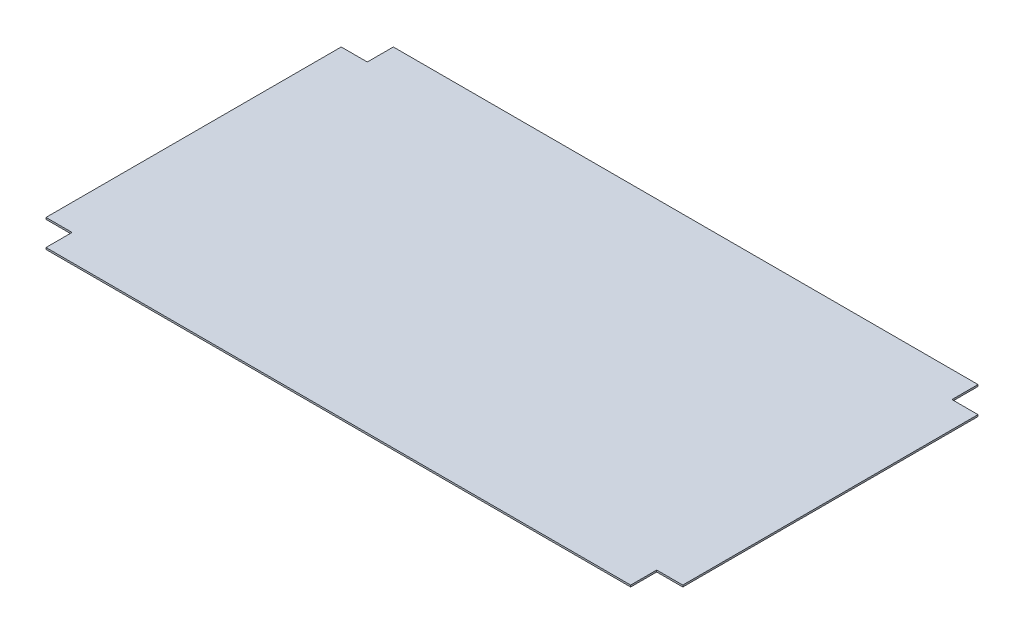
ISO-10303-21;
HEADER;
FILE_DESCRIPTION(('STEP AP214'),'2;1');
FILE_NAME('part.step','',(''),(''),'','','');
FILE_SCHEMA(('AUTOMOTIVE_DESIGN { 1 0 10303 214 1 1 1 1 }'));
ENDSEC;
DATA;
#1=APPLICATION_CONTEXT('core data for automotive mechanical design processes');
#2=APPLICATION_PROTOCOL_DEFINITION('international standard','automotive_design',2000,#1);
#3=PRODUCT_CONTEXT('',#1,'mechanical');
#4=PRODUCT('Part','Part','',(#3));
#5=PRODUCT_RELATED_PRODUCT_CATEGORY('part','',(#4));
#6=PRODUCT_DEFINITION_FORMATION('','',#4);
#7=PRODUCT_DEFINITION_CONTEXT('part definition',#1,'design');
#8=PRODUCT_DEFINITION('design','',#6,#7);
#9=PRODUCT_DEFINITION_SHAPE('','',#8);
#10=(LENGTH_UNIT() NAMED_UNIT(*) SI_UNIT(.MILLI.,.METRE.));
#11=(NAMED_UNIT(*) PLANE_ANGLE_UNIT() SI_UNIT($,.RADIAN.));
#12=(NAMED_UNIT(*) SI_UNIT($,.STERADIAN.) SOLID_ANGLE_UNIT());
#13=UNCERTAINTY_MEASURE_WITH_UNIT(LENGTH_MEASURE(1.E-05),#10,'distance_accuracy_value','');
#14=(GEOMETRIC_REPRESENTATION_CONTEXT(3) GLOBAL_UNCERTAINTY_ASSIGNED_CONTEXT((#13)) GLOBAL_UNIT_ASSIGNED_CONTEXT((#10,
#11,#12)) REPRESENTATION_CONTEXT('',''));
#15=CARTESIAN_POINT('',(0.,0.,0.));
#16=DIRECTION('',(0.,0.,1.));
#17=DIRECTION('',(1.,0.,0.));
#18=AXIS2_PLACEMENT_3D('',#15,#16,#17);
#19=CARTESIAN_POINT('',(-550.,3.,300.));
#20=DIRECTION('',(1.,0.,0.));
#21=DIRECTION('',(0.,0.,-1.));
#22=AXIS2_PLACEMENT_3D('',#19,#20,#21);
#23=PLANE('',#22);
#24=DIRECTION('',(0.,0.,1.));
#25=VECTOR('',#24,1.);
#26=CARTESIAN_POINT('',(-550.,0.,300.));
#27=LINE('',#26,#25);
#28=CARTESIAN_POINT('',(-550.,0.,-255.));
#29=VERTEX_POINT('',#28);
#30=CARTESIAN_POINT('',(-550.,0.,255.));
#31=VERTEX_POINT('',#30);
#32=EDGE_CURVE('E145',#29,#31,#27,.T.);
#33=ORIENTED_EDGE('',*,*,#32,.T.);
#34=DIRECTION('',(0.,1.,0.));
#35=VECTOR('',#34,1.);
#36=CARTESIAN_POINT('',(-550.,0.,255.));
#37=LINE('',#36,#35);
#38=CARTESIAN_POINT('',(-550.,3.,255.));
#39=VERTEX_POINT('',#38);
#40=EDGE_CURVE('E188',#31,#39,#37,.T.);
#41=ORIENTED_EDGE('',*,*,#40,.T.);
#42=DIRECTION('',(0.,0.,1.));
#43=VECTOR('',#42,1.);
#44=CARTESIAN_POINT('',(-550.,3.,300.));
#45=LINE('',#44,#43);
#46=CARTESIAN_POINT('',(-550.,3.,-255.));
#47=VERTEX_POINT('',#46);
#48=EDGE_CURVE('E143',#47,#39,#45,.T.);
#49=ORIENTED_EDGE('',*,*,#48,.F.);
#50=DIRECTION('',(0.,1.,0.));
#51=VECTOR('',#50,1.);
#52=CARTESIAN_POINT('',(-550.,0.,-255.));
#53=LINE('',#52,#51);
#54=EDGE_CURVE('E157',#29,#47,#53,.T.);
#55=ORIENTED_EDGE('',*,*,#54,.F.);
#56=EDGE_LOOP('',(#33,#41,#49,#55));
#57=FACE_BOUND('',#56,.T.);
#58=ADVANCED_FACE('F32',(#57),#23,.F.);
#59=CARTESIAN_POINT('',(550.,3.,300.));
#60=DIRECTION('',(0.,0.,-1.));
#61=DIRECTION('',(-1.,0.,0.));
#62=AXIS2_PLACEMENT_3D('',#59,#60,#61);
#63=PLANE('',#62);
#64=DIRECTION('',(1.,0.,0.));
#65=VECTOR('',#64,1.);
#66=CARTESIAN_POINT('',(550.,0.,300.));
#67=LINE('',#66,#65);
#68=CARTESIAN_POINT('',(-505.,0.,300.));
#69=VERTEX_POINT('',#68);
#70=CARTESIAN_POINT('',(505.,0.,300.));
#71=VERTEX_POINT('',#70);
#72=EDGE_CURVE('E142',#69,#71,#67,.T.);
#73=ORIENTED_EDGE('',*,*,#72,.T.);
#74=DIRECTION('',(0.,1.,0.));
#75=VECTOR('',#74,1.);
#76=CARTESIAN_POINT('',(505.,0.,300.));
#77=LINE('',#76,#75);
#78=CARTESIAN_POINT('',(505.,3.,300.));
#79=VERTEX_POINT('',#78);
#80=EDGE_CURVE('E203',#71,#79,#77,.T.);
#81=ORIENTED_EDGE('',*,*,#80,.T.);
#82=DIRECTION('',(1.,0.,0.));
#83=VECTOR('',#82,1.);
#84=CARTESIAN_POINT('',(550.,3.,300.));
#85=LINE('',#84,#83);
#86=CARTESIAN_POINT('',(-505.,3.,300.));
#87=VERTEX_POINT('',#86);
#88=EDGE_CURVE('E152',#87,#79,#85,.T.);
#89=ORIENTED_EDGE('',*,*,#88,.F.);
#90=DIRECTION('',(0.,1.,0.));
#91=VECTOR('',#90,1.);
#92=CARTESIAN_POINT('',(-505.,0.,300.));
#93=LINE('',#92,#91);
#94=EDGE_CURVE('E191',#69,#87,#93,.T.);
#95=ORIENTED_EDGE('',*,*,#94,.F.);
#96=EDGE_LOOP('',(#73,#81,#89,#95));
#97=FACE_BOUND('',#96,.T.);
#98=ADVANCED_FACE('F216',(#97),#63,.F.);
#99=CARTESIAN_POINT('',(550.,3.,300.));
#100=DIRECTION('',(-1.,0.,0.));
#101=DIRECTION('',(0.,0.,1.));
#102=AXIS2_PLACEMENT_3D('',#99,#100,#101);
#103=PLANE('',#102);
#104=DIRECTION('',(0.,0.,-1.));
#105=VECTOR('',#104,1.);
#106=CARTESIAN_POINT('',(550.,3.,300.));
#107=LINE('',#106,#105);
#108=CARTESIAN_POINT('',(550.,3.,255.));
#109=VERTEX_POINT('',#108);
#110=CARTESIAN_POINT('',(550.,3.,-255.));
#111=VERTEX_POINT('',#110);
#112=EDGE_CURVE('E40',#109,#111,#107,.T.);
#113=ORIENTED_EDGE('',*,*,#112,.F.);
#114=DIRECTION('',(0.,1.,0.));
#115=VECTOR('',#114,1.);
#116=CARTESIAN_POINT('',(550.,0.,255.));
#117=LINE('',#116,#115);
#118=CARTESIAN_POINT('',(550.,0.,255.));
#119=VERTEX_POINT('',#118);
#120=EDGE_CURVE('E124',#119,#109,#117,.T.);
#121=ORIENTED_EDGE('',*,*,#120,.F.);
#122=DIRECTION('',(0.,0.,-1.));
#123=VECTOR('',#122,1.);
#124=CARTESIAN_POINT('',(550.,0.,300.));
#125=LINE('',#124,#123);
#126=CARTESIAN_POINT('',(550.,0.,-255.));
#127=VERTEX_POINT('',#126);
#128=EDGE_CURVE('E135',#119,#127,#125,.T.);
#129=ORIENTED_EDGE('',*,*,#128,.T.);
#130=DIRECTION('',(0.,1.,0.));
#131=VECTOR('',#130,1.);
#132=CARTESIAN_POINT('',(550.,0.,-255.));
#133=LINE('',#132,#131);
#134=EDGE_CURVE('E171',#127,#111,#133,.T.);
#135=ORIENTED_EDGE('',*,*,#134,.T.);
#136=EDGE_LOOP('',(#113,#121,#129,#135));
#137=FACE_BOUND('',#136,.T.);
#138=ADVANCED_FACE('F133',(#137),#103,.F.);
#139=CARTESIAN_POINT('',(550.,3.,-300.));
#140=DIRECTION('',(0.,0.,1.));
#141=DIRECTION('',(1.,0.,0.));
#142=AXIS2_PLACEMENT_3D('',#139,#140,#141);
#143=PLANE('',#142);
#144=DIRECTION('',(-1.,0.,0.));
#145=VECTOR('',#144,1.);
#146=CARTESIAN_POINT('',(550.,3.,-300.));
#147=LINE('',#146,#145);
#148=CARTESIAN_POINT('',(505.,3.,-300.));
#149=VERTEX_POINT('',#148);
#150=CARTESIAN_POINT('',(-505.,3.,-300.));
#151=VERTEX_POINT('',#150);
#152=EDGE_CURVE('E11',#149,#151,#147,.T.);
#153=ORIENTED_EDGE('',*,*,#152,.F.);
#154=DIRECTION('',(0.,1.,0.));
#155=VECTOR('',#154,1.);
#156=CARTESIAN_POINT('',(505.,0.,-300.));
#157=LINE('',#156,#155);
#158=CARTESIAN_POINT('',(505.,0.,-300.));
#159=VERTEX_POINT('',#158);
#160=EDGE_CURVE('E176',#159,#149,#157,.T.);
#161=ORIENTED_EDGE('',*,*,#160,.F.);
#162=DIRECTION('',(-1.,0.,0.));
#163=VECTOR('',#162,1.);
#164=CARTESIAN_POINT('',(550.,0.,-300.));
#165=LINE('',#164,#163);
#166=CARTESIAN_POINT('',(-505.,0.,-300.));
#167=VERTEX_POINT('',#166);
#168=EDGE_CURVE('E35',#159,#167,#165,.T.);
#169=ORIENTED_EDGE('',*,*,#168,.T.);
#170=DIRECTION('',(0.,1.,0.));
#171=VECTOR('',#170,1.);
#172=CARTESIAN_POINT('',(-505.,0.,-300.));
#173=LINE('',#172,#171);
#174=EDGE_CURVE('E149',#167,#151,#173,.T.);
#175=ORIENTED_EDGE('',*,*,#174,.T.);
#176=EDGE_LOOP('',(#153,#161,#169,#175));
#177=FACE_BOUND('',#176,.T.);
#178=ADVANCED_FACE('F241',(#177),#143,.F.);
#179=CARTESIAN_POINT('',(-550.,3.,-300.));
#180=DIRECTION('',(0.,1.,0.));
#181=DIRECTION('',(0.,0.,1.));
#182=AXIS2_PLACEMENT_3D('',#179,#180,#181);
#183=PLANE('',#182);
#184=DIRECTION('',(0.,0.,1.));
#185=VECTOR('',#184,1.);
#186=CARTESIAN_POINT('',(505.,3.,300.));
#187=LINE('',#186,#185);
#188=CARTESIAN_POINT('',(505.,3.,255.));
#189=VERTEX_POINT('',#188);
#190=EDGE_CURVE('E129',#189,#79,#187,.T.);
#191=ORIENTED_EDGE('',*,*,#190,.F.);
#192=DIRECTION('',(-1.,0.,0.));
#193=VECTOR('',#192,1.);
#194=CARTESIAN_POINT('',(550.,3.,255.));
#195=LINE('',#194,#193);
#196=EDGE_CURVE('E211',#109,#189,#195,.T.);
#197=ORIENTED_EDGE('',*,*,#196,.F.);
#198=ORIENTED_EDGE('',*,*,#112,.T.);
#199=DIRECTION('',(1.,0.,0.));
#200=VECTOR('',#199,1.);
#201=CARTESIAN_POINT('',(550.,3.,-255.));
#202=LINE('',#201,#200);
#203=CARTESIAN_POINT('',(505.,3.,-255.));
#204=VERTEX_POINT('',#203);
#205=EDGE_CURVE('E181',#204,#111,#202,.T.);
#206=ORIENTED_EDGE('',*,*,#205,.F.);
#207=DIRECTION('',(0.,0.,1.));
#208=VECTOR('',#207,1.);
#209=CARTESIAN_POINT('',(505.,3.,-300.));
#210=LINE('',#209,#208);
#211=EDGE_CURVE('E185',#149,#204,#210,.T.);
#212=ORIENTED_EDGE('',*,*,#211,.F.);
#213=ORIENTED_EDGE('',*,*,#152,.T.);
#214=DIRECTION('',(0.,0.,-1.));
#215=VECTOR('',#214,1.);
#216=CARTESIAN_POINT('',(-505.,3.,-300.));
#217=LINE('',#216,#215);
#218=CARTESIAN_POINT('',(-505.,3.,-255.));
#219=VERTEX_POINT('',#218);
#220=EDGE_CURVE('E164',#219,#151,#217,.T.);
#221=ORIENTED_EDGE('',*,*,#220,.F.);
#222=DIRECTION('',(1.,0.,0.));
#223=VECTOR('',#222,1.);
#224=CARTESIAN_POINT('',(-550.,3.,-255.));
#225=LINE('',#224,#223);
#226=EDGE_CURVE('E168',#47,#219,#225,.T.);
#227=ORIENTED_EDGE('',*,*,#226,.F.);
#228=ORIENTED_EDGE('',*,*,#48,.T.);
#229=DIRECTION('',(-1.,0.,0.));
#230=VECTOR('',#229,1.);
#231=CARTESIAN_POINT('',(-550.,3.,255.));
#232=LINE('',#231,#230);
#233=CARTESIAN_POINT('',(-505.,3.,255.));
#234=VERTEX_POINT('',#233);
#235=EDGE_CURVE('E197',#234,#39,#232,.T.);
#236=ORIENTED_EDGE('',*,*,#235,.F.);
#237=DIRECTION('',(0.,0.,-1.));
#238=VECTOR('',#237,1.);
#239=CARTESIAN_POINT('',(-505.,3.,300.));
#240=LINE('',#239,#238);
#241=EDGE_CURVE('E200',#87,#234,#240,.T.);
#242=ORIENTED_EDGE('',*,*,#241,.F.);
#243=ORIENTED_EDGE('',*,*,#88,.T.);
#244=EDGE_LOOP('',(#191,#197,#198,#206,#212,#213,#221,#227,#228,#236,#242,#243));
#245=FACE_BOUND('',#244,.T.);
#246=ADVANCED_FACE('F224',(#245),#183,.T.);
#247=CARTESIAN_POINT('',(-550.,0.,-300.));
#248=DIRECTION('',(0.,1.,0.));
#249=DIRECTION('',(0.,0.,1.));
#250=AXIS2_PLACEMENT_3D('',#247,#248,#249);
#251=PLANE('',#250);
#252=DIRECTION('',(-1.,0.,0.));
#253=VECTOR('',#252,1.);
#254=CARTESIAN_POINT('',(550.,0.,255.));
#255=LINE('',#254,#253);
#256=CARTESIAN_POINT('',(505.,0.,255.));
#257=VERTEX_POINT('',#256);
#258=EDGE_CURVE('E120',#119,#257,#255,.T.);
#259=ORIENTED_EDGE('',*,*,#258,.T.);
#260=DIRECTION('',(0.,0.,1.));
#261=VECTOR('',#260,1.);
#262=CARTESIAN_POINT('',(505.,0.,300.));
#263=LINE('',#262,#261);
#264=EDGE_CURVE('E48',#257,#71,#263,.T.);
#265=ORIENTED_EDGE('',*,*,#264,.T.);
#266=ORIENTED_EDGE('',*,*,#72,.F.);
#267=DIRECTION('',(0.,0.,-1.));
#268=VECTOR('',#267,1.);
#269=CARTESIAN_POINT('',(-505.,0.,300.));
#270=LINE('',#269,#268);
#271=CARTESIAN_POINT('',(-505.,0.,255.));
#272=VERTEX_POINT('',#271);
#273=EDGE_CURVE('E199',#69,#272,#270,.T.);
#274=ORIENTED_EDGE('',*,*,#273,.T.);
#275=DIRECTION('',(-1.,0.,0.));
#276=VECTOR('',#275,1.);
#277=CARTESIAN_POINT('',(-550.,0.,255.));
#278=LINE('',#277,#276);
#279=EDGE_CURVE('E56',#272,#31,#278,.T.);
#280=ORIENTED_EDGE('',*,*,#279,.T.);
#281=ORIENTED_EDGE('',*,*,#32,.F.);
#282=DIRECTION('',(1.,0.,0.));
#283=VECTOR('',#282,1.);
#284=CARTESIAN_POINT('',(-550.,0.,-255.));
#285=LINE('',#284,#283);
#286=CARTESIAN_POINT('',(-505.,0.,-255.));
#287=VERTEX_POINT('',#286);
#288=EDGE_CURVE('E167',#29,#287,#285,.T.);
#289=ORIENTED_EDGE('',*,*,#288,.T.);
#290=DIRECTION('',(0.,0.,-1.));
#291=VECTOR('',#290,1.);
#292=CARTESIAN_POINT('',(-505.,0.,-300.));
#293=LINE('',#292,#291);
#294=EDGE_CURVE('E160',#287,#167,#293,.T.);
#295=ORIENTED_EDGE('',*,*,#294,.T.);
#296=ORIENTED_EDGE('',*,*,#168,.F.);
#297=DIRECTION('',(0.,0.,1.));
#298=VECTOR('',#297,1.);
#299=CARTESIAN_POINT('',(505.,0.,-300.));
#300=LINE('',#299,#298);
#301=CARTESIAN_POINT('',(505.,0.,-255.));
#302=VERTEX_POINT('',#301);
#303=EDGE_CURVE('E184',#159,#302,#300,.T.);
#304=ORIENTED_EDGE('',*,*,#303,.T.);
#305=DIRECTION('',(1.,0.,0.));
#306=VECTOR('',#305,1.);
#307=CARTESIAN_POINT('',(550.,0.,-255.));
#308=LINE('',#307,#306);
#309=EDGE_CURVE('E141',#302,#127,#308,.T.);
#310=ORIENTED_EDGE('',*,*,#309,.T.);
#311=ORIENTED_EDGE('',*,*,#128,.F.);
#312=EDGE_LOOP('',(#259,#265,#266,#274,#280,#281,#289,#295,#296,#304,#310,#311));
#313=FACE_BOUND('',#312,.T.);
#314=ADVANCED_FACE('F139',(#313),#251,.F.);
#315=CARTESIAN_POINT('',(-505.,0.,-300.));
#316=DIRECTION('',(1.,0.,0.));
#317=DIRECTION('',(0.,0.,-1.));
#318=AXIS2_PLACEMENT_3D('',#315,#316,#317);
#319=PLANE('',#318);
#320=ORIENTED_EDGE('',*,*,#220,.T.);
#321=ORIENTED_EDGE('',*,*,#174,.F.);
#322=ORIENTED_EDGE('',*,*,#294,.F.);
#323=DIRECTION('',(0.,1.,0.));
#324=VECTOR('',#323,1.);
#325=CARTESIAN_POINT('',(-505.,0.,-255.));
#326=LINE('',#325,#324);
#327=EDGE_CURVE('E159',#287,#219,#326,.T.);
#328=ORIENTED_EDGE('',*,*,#327,.T.);
#329=EDGE_LOOP('',(#320,#321,#322,#328));
#330=FACE_BOUND('',#329,.T.);
#331=ADVANCED_FACE('F237',(#330),#319,.F.);
#332=CARTESIAN_POINT('',(-550.,0.,-255.));
#333=DIRECTION('',(0.,0.,1.));
#334=DIRECTION('',(1.,0.,0.));
#335=AXIS2_PLACEMENT_3D('',#332,#333,#334);
#336=PLANE('',#335);
#337=ORIENTED_EDGE('',*,*,#226,.T.);
#338=ORIENTED_EDGE('',*,*,#327,.F.);
#339=ORIENTED_EDGE('',*,*,#288,.F.);
#340=ORIENTED_EDGE('',*,*,#54,.T.);
#341=EDGE_LOOP('',(#337,#338,#339,#340));
#342=FACE_BOUND('',#341,.T.);
#343=ADVANCED_FACE('F234',(#342),#336,.F.);
#344=CARTESIAN_POINT('',(550.,0.,-255.));
#345=DIRECTION('',(0.,0.,1.));
#346=DIRECTION('',(1.,0.,0.));
#347=AXIS2_PLACEMENT_3D('',#344,#345,#346);
#348=PLANE('',#347);
#349=ORIENTED_EDGE('',*,*,#205,.T.);
#350=ORIENTED_EDGE('',*,*,#134,.F.);
#351=ORIENTED_EDGE('',*,*,#309,.F.);
#352=DIRECTION('',(0.,1.,0.));
#353=VECTOR('',#352,1.);
#354=CARTESIAN_POINT('',(505.,0.,-255.));
#355=LINE('',#354,#353);
#356=EDGE_CURVE('E178',#302,#204,#355,.T.);
#357=ORIENTED_EDGE('',*,*,#356,.T.);
#358=EDGE_LOOP('',(#349,#350,#351,#357));
#359=FACE_BOUND('',#358,.T.);
#360=ADVANCED_FACE('F249',(#359),#348,.F.);
#361=CARTESIAN_POINT('',(505.,0.,-300.));
#362=DIRECTION('',(-1.,0.,0.));
#363=DIRECTION('',(0.,0.,1.));
#364=AXIS2_PLACEMENT_3D('',#361,#362,#363);
#365=PLANE('',#364);
#366=ORIENTED_EDGE('',*,*,#211,.T.);
#367=ORIENTED_EDGE('',*,*,#356,.F.);
#368=ORIENTED_EDGE('',*,*,#303,.F.);
#369=ORIENTED_EDGE('',*,*,#160,.T.);
#370=EDGE_LOOP('',(#366,#367,#368,#369));
#371=FACE_BOUND('',#370,.T.);
#372=ADVANCED_FACE('F245',(#371),#365,.F.);
#373=CARTESIAN_POINT('',(-550.,0.,255.));
#374=DIRECTION('',(0.,0.,-1.));
#375=DIRECTION('',(-1.,0.,0.));
#376=AXIS2_PLACEMENT_3D('',#373,#374,#375);
#377=PLANE('',#376);
#378=ORIENTED_EDGE('',*,*,#235,.T.);
#379=ORIENTED_EDGE('',*,*,#40,.F.);
#380=ORIENTED_EDGE('',*,*,#279,.F.);
#381=DIRECTION('',(0.,1.,0.));
#382=VECTOR('',#381,1.);
#383=CARTESIAN_POINT('',(-505.,0.,255.));
#384=LINE('',#383,#382);
#385=EDGE_CURVE('E193',#272,#234,#384,.T.);
#386=ORIENTED_EDGE('',*,*,#385,.T.);
#387=EDGE_LOOP('',(#378,#379,#380,#386));
#388=FACE_BOUND('',#387,.T.);
#389=ADVANCED_FACE('F227',(#388),#377,.F.);
#390=CARTESIAN_POINT('',(-505.,0.,300.));
#391=DIRECTION('',(1.,0.,0.));
#392=DIRECTION('',(0.,0.,-1.));
#393=AXIS2_PLACEMENT_3D('',#390,#391,#392);
#394=PLANE('',#393);
#395=ORIENTED_EDGE('',*,*,#241,.T.);
#396=ORIENTED_EDGE('',*,*,#385,.F.);
#397=ORIENTED_EDGE('',*,*,#273,.F.);
#398=ORIENTED_EDGE('',*,*,#94,.T.);
#399=EDGE_LOOP('',(#395,#396,#397,#398));
#400=FACE_BOUND('',#399,.T.);
#401=ADVANCED_FACE('F220',(#400),#394,.F.);
#402=CARTESIAN_POINT('',(505.,0.,300.));
#403=DIRECTION('',(-1.,0.,0.));
#404=DIRECTION('',(0.,0.,1.));
#405=AXIS2_PLACEMENT_3D('',#402,#403,#404);
#406=PLANE('',#405);
#407=ORIENTED_EDGE('',*,*,#190,.T.);
#408=ORIENTED_EDGE('',*,*,#80,.F.);
#409=ORIENTED_EDGE('',*,*,#264,.F.);
#410=DIRECTION('',(0.,1.,0.));
#411=VECTOR('',#410,1.);
#412=CARTESIAN_POINT('',(505.,0.,255.));
#413=LINE('',#412,#411);
#414=EDGE_CURVE('E126',#257,#189,#413,.T.);
#415=ORIENTED_EDGE('',*,*,#414,.T.);
#416=EDGE_LOOP('',(#407,#408,#409,#415));
#417=FACE_BOUND('',#416,.T.);
#418=ADVANCED_FACE('F250',(#417),#406,.F.);
#419=CARTESIAN_POINT('',(550.,0.,255.));
#420=DIRECTION('',(0.,0.,-1.));
#421=DIRECTION('',(-1.,0.,0.));
#422=AXIS2_PLACEMENT_3D('',#419,#420,#421);
#423=PLANE('',#422);
#424=ORIENTED_EDGE('',*,*,#196,.T.);
#425=ORIENTED_EDGE('',*,*,#414,.F.);
#426=ORIENTED_EDGE('',*,*,#258,.F.);
#427=ORIENTED_EDGE('',*,*,#120,.T.);
#428=EDGE_LOOP('',(#424,#425,#426,#427));
#429=FACE_BOUND('',#428,.T.);
#430=ADVANCED_FACE('F123',(#429),#423,.F.);
#431=CLOSED_SHELL('',(#58,#98,#138,#178,#246,#314,#331,#343,#360,#372,#389,#401,#418,#430));
#432=MANIFOLD_SOLID_BREP('B2',#431);
#433=ADVANCED_BREP_SHAPE_REPRESENTATION('',(#18,#432),#14);
#434=SHAPE_DEFINITION_REPRESENTATION(#9,#433);
ENDSEC;
END-ISO-10303-21;
